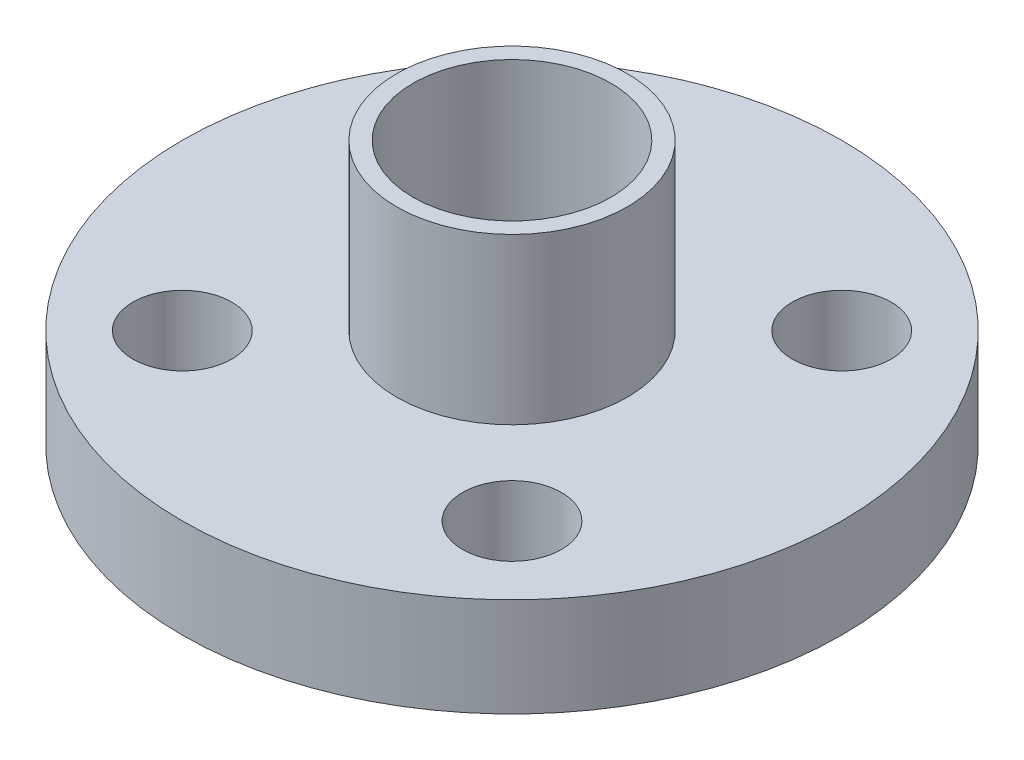
ISO-10303-21;
HEADER;
FILE_DESCRIPTION(('STEP AP214'),'2;1');
FILE_NAME('part.step','',(''),(''),'','','');
FILE_SCHEMA(('AUTOMOTIVE_DESIGN { 1 0 10303 214 1 1 1 1 }'));
ENDSEC;
DATA;
#1=APPLICATION_CONTEXT('core data for automotive mechanical design processes');
#2=APPLICATION_PROTOCOL_DEFINITION('international standard','automotive_design',2000,#1);
#3=PRODUCT_CONTEXT('',#1,'mechanical');
#4=PRODUCT('Part','Part','',(#3));
#5=PRODUCT_RELATED_PRODUCT_CATEGORY('part','',(#4));
#6=PRODUCT_DEFINITION_FORMATION('','',#4);
#7=PRODUCT_DEFINITION_CONTEXT('part definition',#1,'design');
#8=PRODUCT_DEFINITION('design','',#6,#7);
#9=PRODUCT_DEFINITION_SHAPE('','',#8);
#10=(LENGTH_UNIT() NAMED_UNIT(*) SI_UNIT(.MILLI.,.METRE.));
#11=(NAMED_UNIT(*) PLANE_ANGLE_UNIT() SI_UNIT($,.RADIAN.));
#12=(NAMED_UNIT(*) SI_UNIT($,.STERADIAN.) SOLID_ANGLE_UNIT());
#13=UNCERTAINTY_MEASURE_WITH_UNIT(LENGTH_MEASURE(1.E-05),#10,'distance_accuracy_value','');
#14=(GEOMETRIC_REPRESENTATION_CONTEXT(3) GLOBAL_UNCERTAINTY_ASSIGNED_CONTEXT((#13)) GLOBAL_UNIT_ASSIGNED_CONTEXT((#10,
#11,#12)) REPRESENTATION_CONTEXT('',''));
#15=CARTESIAN_POINT('',(0.,0.,0.));
#16=DIRECTION('',(0.,0.,1.));
#17=DIRECTION('',(1.,0.,0.));
#18=AXIS2_PLACEMENT_3D('',#15,#16,#17);
#19=CARTESIAN_POINT('',(-5.,3.,-5.));
#20=DIRECTION('',(0.,-1.,0.));
#21=DIRECTION('',(0.,0.,-1.));
#22=AXIS2_PLACEMENT_3D('',#19,#20,#21);
#23=CYLINDRICAL_SURFACE('',#22,1.5);
#24=CARTESIAN_POINT('',(-5.,3.,-5.));
#25=DIRECTION('',(0.,1.,0.));
#26=DIRECTION('',(0.,0.,1.));
#27=AXIS2_PLACEMENT_3D('',#24,#25,#26);
#28=CIRCLE('',#27,1.5);
#29=CARTESIAN_POINT('',(-5.,3.,-3.5));
#30=VERTEX_POINT('',#29);
#31=EDGE_CURVE('E53',#30,#30,#28,.T.);
#32=ORIENTED_EDGE('',*,*,#31,.T.);
#33=EDGE_LOOP('',(#32));
#34=FACE_BOUND('',#33,.T.);
#35=CARTESIAN_POINT('',(-5.,0.,-5.));
#36=DIRECTION('',(0.,1.,0.));
#37=DIRECTION('',(0.,0.,1.));
#38=AXIS2_PLACEMENT_3D('',#35,#36,#37);
#39=CIRCLE('',#38,1.5);
#40=CARTESIAN_POINT('',(-5.,0.,-3.5));
#41=VERTEX_POINT('',#40);
#42=EDGE_CURVE('E60',#41,#41,#39,.T.);
#43=ORIENTED_EDGE('',*,*,#42,.F.);
#44=EDGE_LOOP('',(#43));
#45=FACE_BOUND('',#44,.T.);
#46=ADVANCED_FACE('F41',(#34,#45),#23,.F.);
#47=CARTESIAN_POINT('',(-5.00000000000005,3.,4.99999999999995));
#48=DIRECTION('',(0.,-1.,0.));
#49=DIRECTION('',(0.,0.,-1.));
#50=AXIS2_PLACEMENT_3D('',#47,#48,#49);
#51=CYLINDRICAL_SURFACE('',#50,1.5);
#52=CARTESIAN_POINT('',(-5.00000000000005,3.,4.99999999999995));
#53=DIRECTION('',(0.,1.,0.));
#54=DIRECTION('',(0.,0.,1.));
#55=AXIS2_PLACEMENT_3D('',#52,#53,#54);
#56=CIRCLE('',#55,1.5);
#57=CARTESIAN_POINT('',(-5.00000000000005,3.,6.49999999999995));
#58=VERTEX_POINT('',#57);
#59=EDGE_CURVE('E75',#58,#58,#56,.T.);
#60=ORIENTED_EDGE('',*,*,#59,.T.);
#61=EDGE_LOOP('',(#60));
#62=FACE_BOUND('',#61,.T.);
#63=CARTESIAN_POINT('',(-5.00000000000005,0.,4.99999999999995));
#64=DIRECTION('',(0.,1.,0.));
#65=DIRECTION('',(0.,0.,1.));
#66=AXIS2_PLACEMENT_3D('',#63,#64,#65);
#67=CIRCLE('',#66,1.5);
#68=CARTESIAN_POINT('',(-5.00000000000005,0.,6.49999999999995));
#69=VERTEX_POINT('',#68);
#70=EDGE_CURVE('E63',#69,#69,#67,.T.);
#71=ORIENTED_EDGE('',*,*,#70,.F.);
#72=EDGE_LOOP('',(#71));
#73=FACE_BOUND('',#72,.T.);
#74=ADVANCED_FACE('F114',(#62,#73),#51,.F.);
#75=CARTESIAN_POINT('',(5.00000000000002,3.,-4.99999999999998));
#76=DIRECTION('',(0.,-1.,0.));
#77=DIRECTION('',(0.,0.,-1.));
#78=AXIS2_PLACEMENT_3D('',#75,#76,#77);
#79=CYLINDRICAL_SURFACE('',#78,1.5);
#80=CARTESIAN_POINT('',(5.00000000000002,3.,-4.99999999999998));
#81=DIRECTION('',(0.,1.,0.));
#82=DIRECTION('',(0.,0.,1.));
#83=AXIS2_PLACEMENT_3D('',#80,#81,#82);
#84=CIRCLE('',#83,1.5);
#85=CARTESIAN_POINT('',(5.00000000000002,3.,-3.49999999999998));
#86=VERTEX_POINT('',#85);
#87=EDGE_CURVE('E78',#86,#86,#84,.T.);
#88=ORIENTED_EDGE('',*,*,#87,.T.);
#89=EDGE_LOOP('',(#88));
#90=FACE_BOUND('',#89,.T.);
#91=CARTESIAN_POINT('',(5.00000000000002,0.,-4.99999999999998));
#92=DIRECTION('',(0.,1.,0.));
#93=DIRECTION('',(0.,0.,1.));
#94=AXIS2_PLACEMENT_3D('',#91,#92,#93);
#95=CIRCLE('',#94,1.5);
#96=CARTESIAN_POINT('',(5.00000000000002,0.,-3.49999999999998));
#97=VERTEX_POINT('',#96);
#98=EDGE_CURVE('E66',#97,#97,#95,.T.);
#99=ORIENTED_EDGE('',*,*,#98,.F.);
#100=EDGE_LOOP('',(#99));
#101=FACE_BOUND('',#100,.T.);
#102=ADVANCED_FACE('F120',(#90,#101),#79,.F.);
#103=CARTESIAN_POINT('',(4.99999999999997,3.,5.00000000000003));
#104=DIRECTION('',(0.,-1.,0.));
#105=DIRECTION('',(0.,0.,-1.));
#106=AXIS2_PLACEMENT_3D('',#103,#104,#105);
#107=CYLINDRICAL_SURFACE('',#106,1.5);
#108=CARTESIAN_POINT('',(4.99999999999997,3.,5.00000000000003));
#109=DIRECTION('',(0.,1.,0.));
#110=DIRECTION('',(0.,0.,1.));
#111=AXIS2_PLACEMENT_3D('',#108,#109,#110);
#112=CIRCLE('',#111,1.5);
#113=CARTESIAN_POINT('',(4.99999999999997,3.,6.50000000000004));
#114=VERTEX_POINT('',#113);
#115=EDGE_CURVE('E59',#114,#114,#112,.T.);
#116=ORIENTED_EDGE('',*,*,#115,.T.);
#117=EDGE_LOOP('',(#116));
#118=FACE_BOUND('',#117,.T.);
#119=CARTESIAN_POINT('',(4.99999999999997,0.,5.00000000000003));
#120=DIRECTION('',(0.,1.,0.));
#121=DIRECTION('',(0.,0.,1.));
#122=AXIS2_PLACEMENT_3D('',#119,#120,#121);
#123=CIRCLE('',#122,1.5);
#124=CARTESIAN_POINT('',(4.99999999999997,0.,6.50000000000004));
#125=VERTEX_POINT('',#124);
#126=EDGE_CURVE('E69',#125,#125,#123,.T.);
#127=ORIENTED_EDGE('',*,*,#126,.F.);
#128=EDGE_LOOP('',(#127));
#129=FACE_BOUND('',#128,.T.);
#130=ADVANCED_FACE('F43',(#118,#129),#107,.F.);
#131=CARTESIAN_POINT('',(0.,3.,0.));
#132=DIRECTION('',(0.,-1.,0.));
#133=DIRECTION('',(0.,0.,-1.));
#134=AXIS2_PLACEMENT_3D('',#131,#132,#133);
#135=CYLINDRICAL_SURFACE('',#134,10.);
#136=CARTESIAN_POINT('',(0.,3.,0.));
#137=DIRECTION('',(0.,1.,0.));
#138=DIRECTION('',(0.,0.,1.));
#139=AXIS2_PLACEMENT_3D('',#136,#137,#138);
#140=CIRCLE('',#139,10.);
#141=CARTESIAN_POINT('',(0.,3.,10.));
#142=VERTEX_POINT('',#141);
#143=EDGE_CURVE('E49',#142,#142,#140,.T.);
#144=ORIENTED_EDGE('',*,*,#143,.F.);
#145=EDGE_LOOP('',(#144));
#146=FACE_BOUND('',#145,.T.);
#147=CARTESIAN_POINT('',(0.,0.,0.));
#148=DIRECTION('',(0.,1.,0.));
#149=DIRECTION('',(0.,0.,1.));
#150=AXIS2_PLACEMENT_3D('',#147,#148,#149);
#151=CIRCLE('',#150,10.);
#152=CARTESIAN_POINT('',(0.,0.,10.));
#153=VERTEX_POINT('',#152);
#154=EDGE_CURVE('E56',#153,#153,#151,.T.);
#155=ORIENTED_EDGE('',*,*,#154,.T.);
#156=EDGE_LOOP('',(#155));
#157=FACE_BOUND('',#156,.T.);
#158=ADVANCED_FACE('F125',(#146,#157),#135,.T.);
#159=CARTESIAN_POINT('',(0.,3.,0.));
#160=DIRECTION('',(0.,1.,0.));
#161=DIRECTION('',(0.,0.,1.));
#162=AXIS2_PLACEMENT_3D('',#159,#160,#161);
#163=PLANE('',#162);
#164=CARTESIAN_POINT('',(0.,3.,0.));
#165=DIRECTION('',(0.,1.,0.));
#166=DIRECTION('',(0.,0.,1.));
#167=AXIS2_PLACEMENT_3D('',#164,#165,#166);
#168=CIRCLE('',#167,3.5);
#169=CARTESIAN_POINT('',(0.,3.,3.5));
#170=VERTEX_POINT('',#169);
#171=EDGE_CURVE('E83',#170,#170,#168,.T.);
#172=ORIENTED_EDGE('',*,*,#171,.F.);
#173=EDGE_LOOP('',(#172));
#174=FACE_BOUND('',#173,.T.);
#175=ORIENTED_EDGE('',*,*,#115,.F.);
#176=EDGE_LOOP('',(#175));
#177=FACE_BOUND('',#176,.T.);
#178=ORIENTED_EDGE('',*,*,#87,.F.);
#179=EDGE_LOOP('',(#178));
#180=FACE_BOUND('',#179,.T.);
#181=ORIENTED_EDGE('',*,*,#59,.F.);
#182=EDGE_LOOP('',(#181));
#183=FACE_BOUND('',#182,.T.);
#184=ORIENTED_EDGE('',*,*,#31,.F.);
#185=EDGE_LOOP('',(#184));
#186=FACE_BOUND('',#185,.T.);
#187=ORIENTED_EDGE('',*,*,#143,.T.);
#188=EDGE_LOOP('',(#187));
#189=FACE_BOUND('',#188,.T.);
#190=ADVANCED_FACE('F111',(#174,#177,#180,#183,#186,#189),#163,.T.);
#191=CARTESIAN_POINT('',(0.,0.,0.));
#192=DIRECTION('',(0.,1.,0.));
#193=DIRECTION('',(0.,0.,1.));
#194=AXIS2_PLACEMENT_3D('',#191,#192,#193);
#195=PLANE('',#194);
#196=CARTESIAN_POINT('',(0.,0.,0.));
#197=DIRECTION('',(0.,1.,0.));
#198=DIRECTION('',(0.,0.,1.));
#199=AXIS2_PLACEMENT_3D('',#196,#197,#198);
#200=CIRCLE('',#199,1.5);
#201=CARTESIAN_POINT('',(0.,0.,1.5));
#202=VERTEX_POINT('',#201);
#203=EDGE_CURVE('E45',#202,#202,#200,.T.);
#204=ORIENTED_EDGE('',*,*,#203,.T.);
#205=EDGE_LOOP('',(#204));
#206=FACE_BOUND('',#205,.T.);
#207=ORIENTED_EDGE('',*,*,#126,.T.);
#208=EDGE_LOOP('',(#207));
#209=FACE_BOUND('',#208,.T.);
#210=ORIENTED_EDGE('',*,*,#98,.T.);
#211=EDGE_LOOP('',(#210));
#212=FACE_BOUND('',#211,.T.);
#213=ORIENTED_EDGE('',*,*,#70,.T.);
#214=EDGE_LOOP('',(#213));
#215=FACE_BOUND('',#214,.T.);
#216=ORIENTED_EDGE('',*,*,#42,.T.);
#217=EDGE_LOOP('',(#216));
#218=FACE_BOUND('',#217,.T.);
#219=ORIENTED_EDGE('',*,*,#154,.F.);
#220=EDGE_LOOP('',(#219));
#221=FACE_BOUND('',#220,.T.);
#222=ADVANCED_FACE('F98',(#206,#209,#212,#215,#218,#221),#195,.F.);
#223=CARTESIAN_POINT('',(0.,8.,0.));
#224=DIRECTION('',(0.,1.,0.));
#225=DIRECTION('',(0.,0.,1.));
#226=AXIS2_PLACEMENT_3D('',#223,#224,#225);
#227=PLANE('',#226);
#228=CARTESIAN_POINT('',(0.,8.,0.));
#229=DIRECTION('',(0.,1.,0.));
#230=DIRECTION('',(0.,0.,1.));
#231=AXIS2_PLACEMENT_3D('',#228,#229,#230);
#232=CIRCLE('',#231,3.5);
#233=CARTESIAN_POINT('',(0.,8.,3.5));
#234=VERTEX_POINT('',#233);
#235=EDGE_CURVE('E71',#234,#234,#232,.T.);
#236=ORIENTED_EDGE('',*,*,#235,.T.);
#237=EDGE_LOOP('',(#236));
#238=FACE_BOUND('',#237,.T.);
#239=CARTESIAN_POINT('',(0.,8.,0.));
#240=DIRECTION('',(0.,1.,0.));
#241=DIRECTION('',(0.,0.,1.));
#242=AXIS2_PLACEMENT_3D('',#239,#240,#241);
#243=CIRCLE('',#242,3.);
#244=CARTESIAN_POINT('',(0.,8.,3.));
#245=VERTEX_POINT('',#244);
#246=EDGE_CURVE('E86',#245,#245,#243,.T.);
#247=ORIENTED_EDGE('',*,*,#246,.F.);
#248=EDGE_LOOP('',(#247));
#249=FACE_BOUND('',#248,.T.);
#250=ADVANCED_FACE('F139',(#238,#249),#227,.T.);
#251=CARTESIAN_POINT('',(0.,8.,0.));
#252=DIRECTION('',(0.,-1.,0.));
#253=DIRECTION('',(0.,0.,-1.));
#254=AXIS2_PLACEMENT_3D('',#251,#252,#253);
#255=CYLINDRICAL_SURFACE('',#254,3.5);
#256=ORIENTED_EDGE('',*,*,#235,.F.);
#257=EDGE_LOOP('',(#256));
#258=FACE_BOUND('',#257,.T.);
#259=ORIENTED_EDGE('',*,*,#171,.T.);
#260=EDGE_LOOP('',(#259));
#261=FACE_BOUND('',#260,.T.);
#262=ADVANCED_FACE('F160',(#258,#261),#255,.T.);
#263=CARTESIAN_POINT('',(0.,8.,0.));
#264=DIRECTION('',(0.,-1.,0.));
#265=DIRECTION('',(0.,0.,-1.));
#266=AXIS2_PLACEMENT_3D('',#263,#264,#265);
#267=CYLINDRICAL_SURFACE('',#266,3.);
#268=ORIENTED_EDGE('',*,*,#246,.T.);
#269=EDGE_LOOP('',(#268));
#270=FACE_BOUND('',#269,.T.);
#271=CARTESIAN_POINT('',(0.,3.,0.));
#272=DIRECTION('',(0.,1.,0.));
#273=DIRECTION('',(0.,0.,1.));
#274=AXIS2_PLACEMENT_3D('',#271,#272,#273);
#275=CIRCLE('',#274,3.);
#276=CARTESIAN_POINT('',(0.,3.,3.));
#277=VERTEX_POINT('',#276);
#278=EDGE_CURVE('E10',#277,#277,#275,.F.);
#279=ORIENTED_EDGE('',*,*,#278,.T.);
#280=EDGE_LOOP('',(#279));
#281=FACE_BOUND('',#280,.T.);
#282=ADVANCED_FACE('F108',(#270,#281),#267,.F.);
#283=CARTESIAN_POINT('',(0.,3.,0.));
#284=DIRECTION('',(0.,1.,0.));
#285=DIRECTION('',(0.,0.,1.));
#286=AXIS2_PLACEMENT_3D('',#283,#284,#285);
#287=CIRCLE('',#286,1.5);
#288=CARTESIAN_POINT('',(0.,3.,1.5));
#289=VERTEX_POINT('',#288);
#290=EDGE_CURVE('E91',#289,#289,#287,.T.);
#291=ORIENTED_EDGE('',*,*,#290,.F.);
#292=EDGE_LOOP('',(#291));
#293=FACE_BOUND('',#292,.T.);
#294=ORIENTED_EDGE('',*,*,#278,.F.);
#295=EDGE_LOOP('',(#294));
#296=FACE_BOUND('',#295,.T.);
#297=ADVANCED_FACE('F103',(#293,#296),#163,.T.);
#298=CARTESIAN_POINT('',(0.,-2.,0.));
#299=DIRECTION('',(0.,1.,0.));
#300=DIRECTION('',(0.,0.,1.));
#301=AXIS2_PLACEMENT_3D('',#298,#299,#300);
#302=CYLINDRICAL_SURFACE('',#301,1.5);
#303=ORIENTED_EDGE('',*,*,#290,.T.);
#304=EDGE_LOOP('',(#303));
#305=FACE_BOUND('',#304,.T.);
#306=ORIENTED_EDGE('',*,*,#203,.F.);
#307=EDGE_LOOP('',(#306));
#308=FACE_BOUND('',#307,.T.);
#309=ADVANCED_FACE('F101',(#305,#308),#302,.F.);
#310=CLOSED_SHELL('',(#46,#74,#102,#130,#158,#190,#222,#250,#262,#282,#297,#309));
#311=MANIFOLD_SOLID_BREP('B2',#310);
#312=ADVANCED_BREP_SHAPE_REPRESENTATION('',(#18,#311),#14);
#313=SHAPE_DEFINITION_REPRESENTATION(#9,#312);
ENDSEC;
END-ISO-10303-21;
